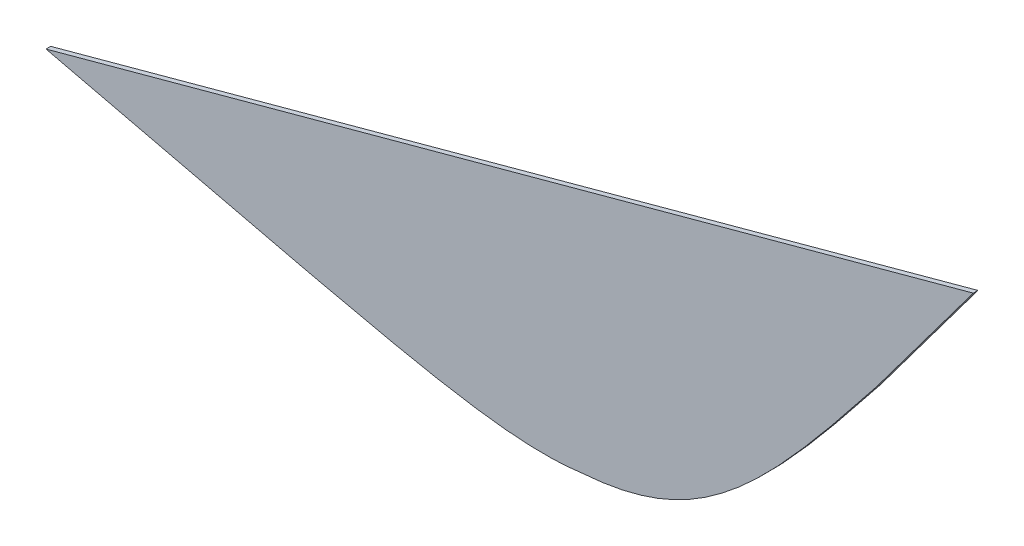
ISO-10303-21;
HEADER;
FILE_DESCRIPTION(('STEP AP214'),'2;1');
FILE_NAME('part.step','',(''),(''),'','','');
FILE_SCHEMA(('AUTOMOTIVE_DESIGN { 1 0 10303 214 1 1 1 1 }'));
ENDSEC;
DATA;
#1=APPLICATION_CONTEXT('core data for automotive mechanical design processes');
#2=APPLICATION_PROTOCOL_DEFINITION('international standard','automotive_design',2000,#1);
#3=PRODUCT_CONTEXT('',#1,'mechanical');
#4=PRODUCT('Part','Part','',(#3));
#5=PRODUCT_RELATED_PRODUCT_CATEGORY('part','',(#4));
#6=PRODUCT_DEFINITION_FORMATION('','',#4);
#7=PRODUCT_DEFINITION_CONTEXT('part definition',#1,'design');
#8=PRODUCT_DEFINITION('design','',#6,#7);
#9=PRODUCT_DEFINITION_SHAPE('','',#8);
#10=(LENGTH_UNIT() NAMED_UNIT(*) SI_UNIT(.MILLI.,.METRE.));
#11=(NAMED_UNIT(*) PLANE_ANGLE_UNIT() SI_UNIT($,.RADIAN.));
#12=(NAMED_UNIT(*) SI_UNIT($,.STERADIAN.) SOLID_ANGLE_UNIT());
#13=UNCERTAINTY_MEASURE_WITH_UNIT(LENGTH_MEASURE(1.E-05),#10,'distance_accuracy_value','');
#14=(GEOMETRIC_REPRESENTATION_CONTEXT(3) GLOBAL_UNCERTAINTY_ASSIGNED_CONTEXT((#13)) GLOBAL_UNIT_ASSIGNED_CONTEXT((#10,
#11,#12)) REPRESENTATION_CONTEXT('',''));
#15=CARTESIAN_POINT('',(0.,0.,0.));
#16=DIRECTION('',(0.,0.,1.));
#17=DIRECTION('',(1.,0.,0.));
#18=AXIS2_PLACEMENT_3D('',#15,#16,#17);
#19=CARTESIAN_POINT('',(-589.536273057464,282.297875154487,5.));
#20=CARTESIAN_POINT('',(116.561380270873,120.122243094386,5.));
#21=CARTESIAN_POINT('',(141.848194953504,128.234817220147,5.));
#22=CARTESIAN_POINT('',(700.205604925085,770.085305884344,5.));
#23=B_SPLINE_CURVE_WITH_KNOTS('',3,(#19,#20,#21,#22),.UNSPECIFIED.,.F.,.F.,(4,4),(0.,1.),.UNSPECIFIED.);
#24=DIRECTION('',(0.,0.,-1.));
#25=VECTOR('',#24,1.);
#26=SURFACE_OF_LINEAR_EXTRUSION('',#23,#25);
#27=CARTESIAN_POINT('',(-589.536273057464,282.297875154487,-5.));
#28=CARTESIAN_POINT('',(116.561380270873,120.122243094386,-5.));
#29=CARTESIAN_POINT('',(141.848194953504,128.234817220147,-5.));
#30=CARTESIAN_POINT('',(700.205604925085,770.085305884344,-5.));
#31=B_SPLINE_CURVE_WITH_KNOTS('',3,(#27,#28,#29,#30),.UNSPECIFIED.,.F.,.F.,(4,4),(0.,1.),.UNSPECIFIED.);
#32=CARTESIAN_POINT('',(-553.884094345107,274.125270688949,-5.));
#33=VERTEX_POINT('',#32);
#34=CARTESIAN_POINT('',(10.0920382591408,199.279616809349,-5.));
#35=VERTEX_POINT('',#34);
#36=EDGE_CURVE('E158',#33,#35,#31,.T.);
#37=ORIENTED_EDGE('',*,*,#36,.T.);
#38=DIRECTION('',(0.,0.,-1.));
#39=VECTOR('',#38,1.);
#40=CARTESIAN_POINT('',(10.0920382591618,199.279616809352,0.));
#41=LINE('',#40,#39);
#42=CARTESIAN_POINT('',(10.0920382591408,199.279616809349,5.));
#43=VERTEX_POINT('',#42);
#44=EDGE_CURVE('E49',#35,#43,#41,.F.);
#45=ORIENTED_EDGE('',*,*,#44,.T.);
#46=CARTESIAN_POINT('',(-553.884094345107,274.125270688949,5.));
#47=VERTEX_POINT('',#46);
#48=EDGE_CURVE('E53',#47,#43,#23,.T.);
#49=ORIENTED_EDGE('',*,*,#48,.F.);
#50=DIRECTION('',(0.,0.,-1.));
#51=VECTOR('',#50,1.);
#52=CARTESIAN_POINT('',(-553.884095880872,274.125271040122,0.));
#53=LINE('',#52,#51);
#54=EDGE_CURVE('E131',#47,#33,#53,.T.);
#55=ORIENTED_EDGE('',*,*,#54,.T.);
#56=EDGE_LOOP('',(#37,#45,#49,#55));
#57=FACE_BOUND('',#56,.T.);
#58=ADVANCED_FACE('F34',(#57),#26,.F.);
#59=CARTESIAN_POINT('',(110.737257192594,224.681795247804,5.));
#60=DIRECTION('',(0.,0.,1.));
#61=DIRECTION('',(1.,0.,0.));
#62=AXIS2_PLACEMENT_3D('',#59,#60,#61);
#63=PLANE('',#62);
#64=ORIENTED_EDGE('',*,*,#48,.T.);
#65=CARTESIAN_POINT('',(637.78564616257,672.312444587732,4.99999999999989));
#66=CARTESIAN_POINT('',(248.934023890655,179.435642482588,4.99999999999989));
#67=CARTESIAN_POINT('',(152.966629698113,110.557627428761,4.99999999999989));
#68=CARTESIAN_POINT('',(-589.536273057464,282.297875154487,4.99999999999989));
#69=B_SPLINE_CURVE_WITH_KNOTS('',3,(#65,#66,#67,#68),.UNSPECIFIED.,.F.,.F.,(4,4),(0.,1.),.UNSPECIFIED.);
#70=CARTESIAN_POINT('',(637.78564616257,672.312444587732,4.99999999999989));
#71=VERTEX_POINT('',#70);
#72=EDGE_CURVE('E117',#71,#43,#69,.T.);
#73=ORIENTED_EDGE('',*,*,#72,.F.);
#74=DIRECTION('',(-0.598705969376802,-0.80096888967836,0.));
#75=VECTOR('',#74,1.);
#76=CARTESIAN_POINT('',(637.78564616257,672.312444587732,4.99999999999989));
#77=LINE('',#76,#75);
#78=CARTESIAN_POINT('',(844.917078578668,949.41980934727,4.99999999999989));
#79=VERTEX_POINT('',#78);
#80=EDGE_CURVE('E91',#79,#71,#77,.T.);
#81=ORIENTED_EDGE('',*,*,#80,.F.);
#82=DIRECTION('',(0.964930706143645,0.262504728226231,0.));
#83=VECTOR('',#82,1.);
#84=CARTESIAN_POINT('',(-700.700191259237,528.942112060509,5.));
#85=LINE('',#84,#83);
#86=CARTESIAN_POINT('',(-1133.94131130878,411.080962289923,4.99999999999989));
#87=VERTEX_POINT('',#86);
#88=EDGE_CURVE('E11',#87,#79,#85,.T.);
#89=ORIENTED_EDGE('',*,*,#88,.F.);
#90=DIRECTION('',(-0.973142367242569,0.230204111773723,0.));
#91=VECTOR('',#90,1.);
#92=CARTESIAN_POINT('',(-1133.94131130878,411.080962289923,4.99999999999989));
#93=LINE('',#92,#91);
#94=CARTESIAN_POINT('',(-589.536273057464,282.297875154487,5.));
#95=VERTEX_POINT('',#94);
#96=EDGE_CURVE('E88',#95,#87,#93,.T.);
#97=ORIENTED_EDGE('',*,*,#96,.F.);
#98=EDGE_CURVE('E122',#47,#95,#69,.T.);
#99=ORIENTED_EDGE('',*,*,#98,.F.);
#100=EDGE_LOOP('',(#64,#73,#81,#89,#97,#99));
#101=FACE_BOUND('',#100,.T.);
#102=ADVANCED_FACE('F85',(#101),#63,.T.);
#103=CARTESIAN_POINT('',(110.737257192594,224.681795247804,-5.));
#104=DIRECTION('',(0.,0.,1.));
#105=DIRECTION('',(1.,0.,0.));
#106=AXIS2_PLACEMENT_3D('',#103,#104,#105);
#107=PLANE('',#106);
#108=ORIENTED_EDGE('',*,*,#36,.F.);
#109=CARTESIAN_POINT('',(637.78564616257,672.312444587732,-5.));
#110=CARTESIAN_POINT('',(248.934023890655,179.435642482588,-5.));
#111=CARTESIAN_POINT('',(152.966629698113,110.557627428761,-5.));
#112=CARTESIAN_POINT('',(-589.536273057464,282.297875154487,-5.));
#113=B_SPLINE_CURVE_WITH_KNOTS('',3,(#109,#110,#111,#112),.UNSPECIFIED.,.F.,.F.,(4,4),(0.,1.),.UNSPECIFIED.);
#114=CARTESIAN_POINT('',(-589.536273057464,282.297875154487,-5.));
#115=VERTEX_POINT('',#114);
#116=EDGE_CURVE('E173',#33,#115,#113,.T.);
#117=ORIENTED_EDGE('',*,*,#116,.T.);
#118=DIRECTION('',(-0.973142367242569,0.230204111773723,0.));
#119=VECTOR('',#118,1.);
#120=CARTESIAN_POINT('',(-1133.94131130878,411.080962289923,-5.));
#121=LINE('',#120,#119);
#122=CARTESIAN_POINT('',(-1133.94131130878,411.080962289923,-5.));
#123=VERTEX_POINT('',#122);
#124=EDGE_CURVE('E109',#115,#123,#121,.T.);
#125=ORIENTED_EDGE('',*,*,#124,.T.);
#126=DIRECTION('',(0.964930706143645,0.262504728226231,0.));
#127=VECTOR('',#126,1.);
#128=CARTESIAN_POINT('',(-22.246664032671,713.512110346194,-5.));
#129=LINE('',#128,#127);
#130=CARTESIAN_POINT('',(844.917078578668,949.41980934727,-5.));
#131=VERTEX_POINT('',#130);
#132=EDGE_CURVE('E42',#123,#131,#129,.T.);
#133=ORIENTED_EDGE('',*,*,#132,.T.);
#134=DIRECTION('',(-0.598705969376802,-0.80096888967836,0.));
#135=VECTOR('',#134,1.);
#136=CARTESIAN_POINT('',(637.78564616257,672.312444587732,-5.));
#137=LINE('',#136,#135);
#138=CARTESIAN_POINT('',(637.78564616257,672.312444587732,-5.));
#139=VERTEX_POINT('',#138);
#140=EDGE_CURVE('E106',#131,#139,#137,.T.);
#141=ORIENTED_EDGE('',*,*,#140,.T.);
#142=EDGE_CURVE('E113',#139,#35,#113,.T.);
#143=ORIENTED_EDGE('',*,*,#142,.T.);
#144=EDGE_LOOP('',(#108,#117,#125,#133,#141,#143));
#145=FACE_BOUND('',#144,.T.);
#146=ADVANCED_FACE('F36',(#145),#107,.F.);
#147=CARTESIAN_POINT('',(-700.700191259237,528.942112060509,-5.));
#148=DIRECTION('',(0.262504728226231,-0.964930706143645,0.));
#149=DIRECTION('',(0.964930706143645,0.262504728226231,0.));
#150=AXIS2_PLACEMENT_3D('',#147,#148,#149);
#151=PLANE('',#150);
#152=ORIENTED_EDGE('',*,*,#132,.F.);
#153=DIRECTION('',(0.,0.,-1.));
#154=VECTOR('',#153,1.);
#155=CARTESIAN_POINT('',(-1133.94131130878,411.080962289923,2141.11263062747));
#156=LINE('',#155,#154);
#157=EDGE_CURVE('E96',#87,#123,#156,.T.);
#158=ORIENTED_EDGE('',*,*,#157,.F.);
#159=ORIENTED_EDGE('',*,*,#88,.T.);
#160=DIRECTION('',(0.,0.,-1.));
#161=VECTOR('',#160,1.);
#162=CARTESIAN_POINT('',(844.917078578668,949.41980934727,2141.11263062747));
#163=LINE('',#162,#161);
#164=EDGE_CURVE('E101',#79,#131,#163,.T.);
#165=ORIENTED_EDGE('',*,*,#164,.T.);
#166=EDGE_LOOP('',(#152,#158,#159,#165));
#167=FACE_BOUND('',#166,.T.);
#168=ADVANCED_FACE('F97',(#167),#151,.F.);
#169=CARTESIAN_POINT('',(637.78564616257,672.312444587732,2141.11263062747));
#170=CARTESIAN_POINT('',(248.934023890655,179.435642482588,2141.11263062747));
#171=CARTESIAN_POINT('',(152.966629698113,110.557627428761,2141.11263062747));
#172=CARTESIAN_POINT('',(-589.536273057464,282.297875154487,2141.11263062747));
#173=B_SPLINE_CURVE_WITH_KNOTS('',3,(#169,#170,#171,#172),.UNSPECIFIED.,.F.,.F.,(4,4),(0.,1.),.UNSPECIFIED.);
#174=DIRECTION('',(0.,0.,-1.));
#175=VECTOR('',#174,1.);
#176=SURFACE_OF_LINEAR_EXTRUSION('',#173,#175);
#177=ORIENTED_EDGE('',*,*,#54,.F.);
#178=ORIENTED_EDGE('',*,*,#98,.T.);
#179=DIRECTION('',(0.,0.,-1.));
#180=VECTOR('',#179,1.);
#181=CARTESIAN_POINT('',(-589.536273057464,282.297875154487,2141.11263062747));
#182=LINE('',#181,#180);
#183=EDGE_CURVE('E105',#95,#115,#182,.T.);
#184=ORIENTED_EDGE('',*,*,#183,.T.);
#185=ORIENTED_EDGE('',*,*,#116,.F.);
#186=EDGE_LOOP('',(#177,#178,#184,#185));
#187=FACE_BOUND('',#186,.T.);
#188=ADVANCED_FACE('F146',(#187),#176,.T.);
#189=CARTESIAN_POINT('',(-1133.94131130878,411.080962289923,2141.11263062747));
#190=DIRECTION('',(-0.230204111773723,-0.973142367242569,0.));
#191=DIRECTION('',(0.973142367242569,-0.230204111773723,0.));
#192=AXIS2_PLACEMENT_3D('',#189,#190,#191);
#193=PLANE('',#192);
#194=ORIENTED_EDGE('',*,*,#183,.F.);
#195=ORIENTED_EDGE('',*,*,#96,.T.);
#196=ORIENTED_EDGE('',*,*,#157,.T.);
#197=ORIENTED_EDGE('',*,*,#124,.F.);
#198=EDGE_LOOP('',(#194,#195,#196,#197));
#199=FACE_BOUND('',#198,.T.);
#200=ADVANCED_FACE('F103',(#199),#193,.T.);
#201=ORIENTED_EDGE('',*,*,#44,.F.);
#202=ORIENTED_EDGE('',*,*,#142,.F.);
#203=DIRECTION('',(0.,0.,-1.));
#204=VECTOR('',#203,1.);
#205=CARTESIAN_POINT('',(637.78564616257,672.312444587732,2141.11263062747));
#206=LINE('',#205,#204);
#207=EDGE_CURVE('E127',#71,#139,#206,.T.);
#208=ORIENTED_EDGE('',*,*,#207,.F.);
#209=ORIENTED_EDGE('',*,*,#72,.T.);
#210=EDGE_LOOP('',(#201,#202,#208,#209));
#211=FACE_BOUND('',#210,.T.);
#212=ADVANCED_FACE('F141',(#211),#176,.T.);
#213=CARTESIAN_POINT('',(637.78564616257,672.312444587732,2141.11263062747));
#214=DIRECTION('',(0.80096888967836,-0.598705969376802,0.));
#215=DIRECTION('',(0.598705969376802,0.80096888967836,0.));
#216=AXIS2_PLACEMENT_3D('',#213,#214,#215);
#217=PLANE('',#216);
#218=ORIENTED_EDGE('',*,*,#164,.F.);
#219=ORIENTED_EDGE('',*,*,#80,.T.);
#220=ORIENTED_EDGE('',*,*,#207,.T.);
#221=ORIENTED_EDGE('',*,*,#140,.F.);
#222=EDGE_LOOP('',(#218,#219,#220,#221));
#223=FACE_BOUND('',#222,.T.);
#224=ADVANCED_FACE('F144',(#223),#217,.T.);
#225=CLOSED_SHELL('',(#58,#102,#146,#168,#188,#200,#212,#224));
#226=MANIFOLD_SOLID_BREP('B2',#225);
#227=ADVANCED_BREP_SHAPE_REPRESENTATION('',(#18,#226),#14);
#228=SHAPE_DEFINITION_REPRESENTATION(#9,#227);
ENDSEC;
END-ISO-10303-21;
